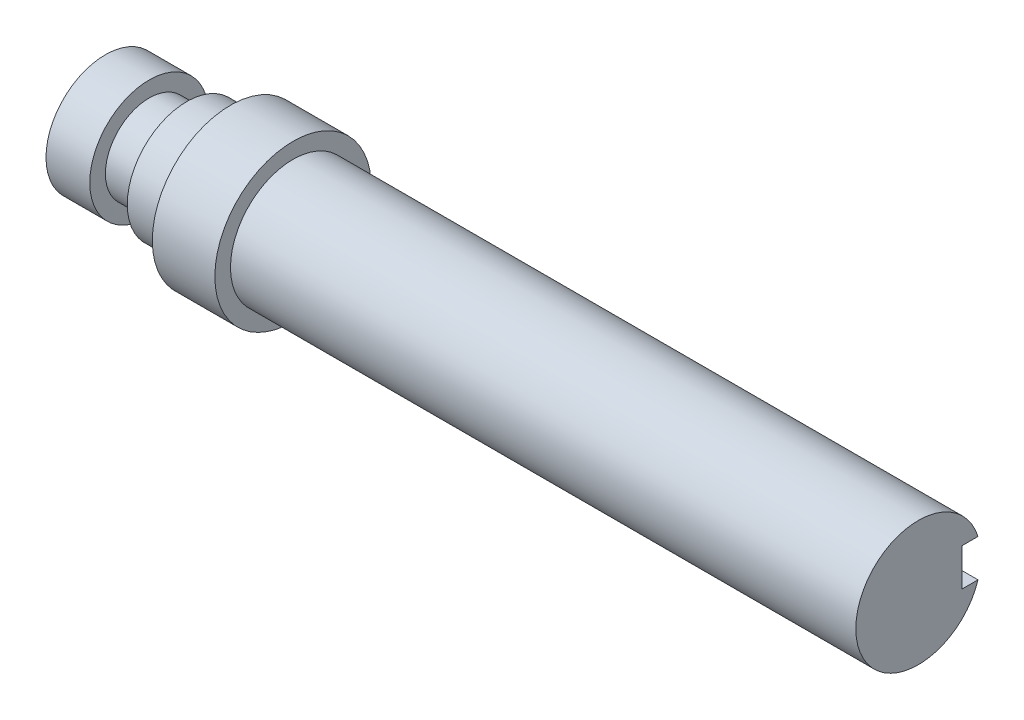
ISO-10303-21;
HEADER;
FILE_DESCRIPTION(('STEP AP214'),'2;1');
FILE_NAME('part.step','',(''),(''),'','','');
FILE_SCHEMA(('AUTOMOTIVE_DESIGN { 1 0 10303 214 1 1 1 1 }'));
ENDSEC;
DATA;
#1=APPLICATION_CONTEXT('core data for automotive mechanical design processes');
#2=APPLICATION_PROTOCOL_DEFINITION('international standard','automotive_design',2000,#1);
#3=PRODUCT_CONTEXT('',#1,'mechanical');
#4=PRODUCT('Part','Part','',(#3));
#5=PRODUCT_RELATED_PRODUCT_CATEGORY('part','',(#4));
#6=PRODUCT_DEFINITION_FORMATION('','',#4);
#7=PRODUCT_DEFINITION_CONTEXT('part definition',#1,'design');
#8=PRODUCT_DEFINITION('design','',#6,#7);
#9=PRODUCT_DEFINITION_SHAPE('','',#8);
#10=(LENGTH_UNIT() NAMED_UNIT(*) SI_UNIT(.MILLI.,.METRE.));
#11=(NAMED_UNIT(*) PLANE_ANGLE_UNIT() SI_UNIT($,.RADIAN.));
#12=(NAMED_UNIT(*) SI_UNIT($,.STERADIAN.) SOLID_ANGLE_UNIT());
#13=UNCERTAINTY_MEASURE_WITH_UNIT(LENGTH_MEASURE(1.E-05),#10,'distance_accuracy_value','');
#14=(GEOMETRIC_REPRESENTATION_CONTEXT(3) GLOBAL_UNCERTAINTY_ASSIGNED_CONTEXT((#13)) GLOBAL_UNIT_ASSIGNED_CONTEXT((#10,
#11,#12)) REPRESENTATION_CONTEXT('',''));
#15=CARTESIAN_POINT('',(0.,0.,0.));
#16=DIRECTION('',(0.,0.,1.));
#17=DIRECTION('',(1.,0.,0.));
#18=AXIS2_PLACEMENT_3D('',#15,#16,#17);
#19=CARTESIAN_POINT('',(0.,0.,0.));
#20=DIRECTION('',(-1.,0.,0.));
#21=DIRECTION('',(0.,0.,1.));
#22=AXIS2_PLACEMENT_3D('',#19,#20,#21);
#23=CYLINDRICAL_SURFACE('',#22,9.99999999999999);
#24=CARTESIAN_POINT('',(30.,0.,0.));
#25=DIRECTION('',(-1.,0.,0.));
#26=DIRECTION('',(0.,0.,1.));
#27=AXIS2_PLACEMENT_3D('',#24,#25,#26);
#28=CIRCLE('',#27,9.99999999999999);
#29=CARTESIAN_POINT('',(30.,0.,9.99999999999999));
#30=VERTEX_POINT('',#29);
#31=EDGE_CURVE('E134',#30,#30,#28,.T.);
#32=ORIENTED_EDGE('',*,*,#31,.F.);
#33=EDGE_LOOP('',(#32));
#34=FACE_BOUND('',#33,.T.);
#35=CARTESIAN_POINT('',(110.,0.,0.));
#36=DIRECTION('',(-1.,0.,0.));
#37=DIRECTION('',(0.,0.,1.));
#38=AXIS2_PLACEMENT_3D('',#35,#36,#37);
#39=CIRCLE('',#38,9.99999999999999);
#40=CARTESIAN_POINT('',(110.,3.,-9.53939201416945));
#41=VERTEX_POINT('',#40);
#42=CARTESIAN_POINT('',(110.,-3.,-9.53939201416945));
#43=VERTEX_POINT('',#42);
#44=EDGE_CURVE('E47',#41,#43,#39,.T.);
#45=ORIENTED_EDGE('',*,*,#44,.T.);
#46=DIRECTION('',(-1.,0.,0.));
#47=VECTOR('',#46,1.);
#48=CARTESIAN_POINT('',(0.,-3.,-9.53939201416945));
#49=LINE('',#48,#47);
#50=CARTESIAN_POINT('',(130.,-3.,-9.53939201416945));
#51=VERTEX_POINT('',#50);
#52=EDGE_CURVE('E11',#43,#51,#49,.F.);
#53=ORIENTED_EDGE('',*,*,#52,.T.);
#54=CARTESIAN_POINT('',(130.,0.,0.));
#55=DIRECTION('',(-1.,0.,0.));
#56=DIRECTION('',(0.,0.,1.));
#57=AXIS2_PLACEMENT_3D('',#54,#55,#56);
#58=CIRCLE('',#57,10.);
#59=CARTESIAN_POINT('',(130.,3.,-9.53939201416945));
#60=VERTEX_POINT('',#59);
#61=EDGE_CURVE('E102',#51,#60,#58,.T.);
#62=ORIENTED_EDGE('',*,*,#61,.T.);
#63=DIRECTION('',(-1.,0.,0.));
#64=VECTOR('',#63,1.);
#65=CARTESIAN_POINT('',(0.,3.,-9.53939201416945));
#66=LINE('',#65,#64);
#67=EDGE_CURVE('E138',#41,#60,#66,.F.);
#68=ORIENTED_EDGE('',*,*,#67,.F.);
#69=EDGE_LOOP('',(#45,#53,#62,#68));
#70=FACE_BOUND('',#69,.T.);
#71=ADVANCED_FACE('F39',(#34,#70),#23,.T.);
#72=CARTESIAN_POINT('',(0.,0.,-9.5));
#73=DIRECTION('',(1.,0.,0.));
#74=DIRECTION('',(0.,0.,-1.));
#75=AXIS2_PLACEMENT_3D('',#72,#73,#74);
#76=PLANE('',#75);
#77=CARTESIAN_POINT('',(0.,0.,0.));
#78=DIRECTION('',(-1.,0.,0.));
#79=DIRECTION('',(0.,0.,1.));
#80=AXIS2_PLACEMENT_3D('',#77,#78,#79);
#81=CIRCLE('',#80,9.5);
#82=CARTESIAN_POINT('',(0.,0.,9.5));
#83=VERTEX_POINT('',#82);
#84=EDGE_CURVE('E96',#83,#83,#81,.T.);
#85=ORIENTED_EDGE('',*,*,#84,.T.);
#86=EDGE_LOOP('',(#85));
#87=FACE_BOUND('',#86,.T.);
#88=ADVANCED_FACE('F41',(#87),#76,.F.);
#89=CARTESIAN_POINT('',(130.,0.,0.));
#90=DIRECTION('',(-1.,0.,0.));
#91=DIRECTION('',(0.,0.,1.));
#92=AXIS2_PLACEMENT_3D('',#89,#90,#91);
#93=PLANE('',#92);
#94=ORIENTED_EDGE('',*,*,#61,.F.);
#95=DIRECTION('',(0.,0.,1.));
#96=VECTOR('',#95,1.);
#97=CARTESIAN_POINT('',(130.,-3.,-9.99999999999999));
#98=LINE('',#97,#96);
#99=CARTESIAN_POINT('',(130.,-3.,-6.99999999999999));
#100=VERTEX_POINT('',#99);
#101=EDGE_CURVE('E82',#51,#100,#98,.T.);
#102=ORIENTED_EDGE('',*,*,#101,.T.);
#103=DIRECTION('',(0.,1.,0.));
#104=VECTOR('',#103,1.);
#105=CARTESIAN_POINT('',(130.,-3.,-6.99999999999999));
#106=LINE('',#105,#104);
#107=CARTESIAN_POINT('',(130.,3.,-6.99999999999999));
#108=VERTEX_POINT('',#107);
#109=EDGE_CURVE('E91',#100,#108,#106,.T.);
#110=ORIENTED_EDGE('',*,*,#109,.T.);
#111=DIRECTION('',(0.,0.,1.));
#112=VECTOR('',#111,1.);
#113=CARTESIAN_POINT('',(130.,3.,-9.99999999999999));
#114=LINE('',#113,#112);
#115=EDGE_CURVE('E107',#60,#108,#114,.T.);
#116=ORIENTED_EDGE('',*,*,#115,.F.);
#117=EDGE_LOOP('',(#94,#102,#110,#116));
#118=FACE_BOUND('',#117,.T.);
#119=ADVANCED_FACE('F100',(#118),#93,.F.);
#120=CARTESIAN_POINT('',(30.,0.,-9.99999999999999));
#121=DIRECTION('',(-1.,0.,0.));
#122=DIRECTION('',(0.,0.,1.));
#123=AXIS2_PLACEMENT_3D('',#120,#121,#122);
#124=PLANE('',#123);
#125=CARTESIAN_POINT('',(30.,0.,0.));
#126=DIRECTION('',(-1.,0.,0.));
#127=DIRECTION('',(0.,0.,1.));
#128=AXIS2_PLACEMENT_3D('',#125,#126,#127);
#129=CIRCLE('',#128,12.5);
#130=CARTESIAN_POINT('',(30.,0.,12.5));
#131=VERTEX_POINT('',#130);
#132=EDGE_CURVE('E131',#131,#131,#129,.T.);
#133=ORIENTED_EDGE('',*,*,#132,.F.);
#134=EDGE_LOOP('',(#133));
#135=FACE_BOUND('',#134,.T.);
#136=ORIENTED_EDGE('',*,*,#31,.T.);
#137=EDGE_LOOP('',(#136));
#138=FACE_BOUND('',#137,.T.);
#139=ADVANCED_FACE('F165',(#135,#138),#124,.F.);
#140=CARTESIAN_POINT('',(0.,0.,0.));
#141=DIRECTION('',(-1.,0.,0.));
#142=DIRECTION('',(0.,0.,1.));
#143=AXIS2_PLACEMENT_3D('',#140,#141,#142);
#144=CYLINDRICAL_SURFACE('',#143,12.5);
#145=CARTESIAN_POINT('',(20.,0.,0.));
#146=DIRECTION('',(-1.,0.,0.));
#147=DIRECTION('',(0.,0.,1.));
#148=AXIS2_PLACEMENT_3D('',#145,#146,#147);
#149=CIRCLE('',#148,12.5);
#150=CARTESIAN_POINT('',(20.,0.,12.5));
#151=VERTEX_POINT('',#150);
#152=EDGE_CURVE('E128',#151,#151,#149,.T.);
#153=ORIENTED_EDGE('',*,*,#152,.F.);
#154=EDGE_LOOP('',(#153));
#155=FACE_BOUND('',#154,.T.);
#156=ORIENTED_EDGE('',*,*,#132,.T.);
#157=EDGE_LOOP('',(#156));
#158=FACE_BOUND('',#157,.T.);
#159=ADVANCED_FACE('F170',(#155,#158),#144,.T.);
#160=CARTESIAN_POINT('',(20.,0.,-12.5));
#161=DIRECTION('',(1.,0.,0.));
#162=DIRECTION('',(0.,0.,-1.));
#163=AXIS2_PLACEMENT_3D('',#160,#161,#162);
#164=PLANE('',#163);
#165=CARTESIAN_POINT('',(20.,0.,0.));
#166=DIRECTION('',(-1.,0.,0.));
#167=DIRECTION('',(0.,0.,1.));
#168=AXIS2_PLACEMENT_3D('',#165,#166,#167);
#169=CIRCLE('',#168,9.5);
#170=CARTESIAN_POINT('',(20.,0.,9.5));
#171=VERTEX_POINT('',#170);
#172=EDGE_CURVE('E125',#171,#171,#169,.T.);
#173=ORIENTED_EDGE('',*,*,#172,.F.);
#174=EDGE_LOOP('',(#173));
#175=FACE_BOUND('',#174,.T.);
#176=ORIENTED_EDGE('',*,*,#152,.T.);
#177=EDGE_LOOP('',(#176));
#178=FACE_BOUND('',#177,.T.);
#179=ADVANCED_FACE('F175',(#175,#178),#164,.F.);
#180=CARTESIAN_POINT('',(0.,0.,0.));
#181=DIRECTION('',(-1.,0.,0.));
#182=DIRECTION('',(0.,0.,1.));
#183=AXIS2_PLACEMENT_3D('',#180,#181,#182);
#184=CYLINDRICAL_SURFACE('',#183,9.5);
#185=CARTESIAN_POINT('',(13.,0.,0.));
#186=DIRECTION('',(-1.,0.,0.));
#187=DIRECTION('',(0.,0.,1.));
#188=AXIS2_PLACEMENT_3D('',#185,#186,#187);
#189=CIRCLE('',#188,9.5);
#190=CARTESIAN_POINT('',(13.,0.,9.5));
#191=VERTEX_POINT('',#190);
#192=EDGE_CURVE('E122',#191,#191,#189,.T.);
#193=ORIENTED_EDGE('',*,*,#192,.F.);
#194=EDGE_LOOP('',(#193));
#195=FACE_BOUND('',#194,.T.);
#196=ORIENTED_EDGE('',*,*,#172,.T.);
#197=EDGE_LOOP('',(#196));
#198=FACE_BOUND('',#197,.T.);
#199=ADVANCED_FACE('F183',(#195,#198),#184,.T.);
#200=CARTESIAN_POINT('',(13.,0.,-9.5));
#201=DIRECTION('',(1.,0.,0.));
#202=DIRECTION('',(0.,0.,-1.));
#203=AXIS2_PLACEMENT_3D('',#200,#201,#202);
#204=PLANE('',#203);
#205=CARTESIAN_POINT('',(13.,0.,0.));
#206=DIRECTION('',(-1.,0.,0.));
#207=DIRECTION('',(0.,0.,1.));
#208=AXIS2_PLACEMENT_3D('',#205,#206,#207);
#209=CIRCLE('',#208,7.);
#210=CARTESIAN_POINT('',(13.,0.,7.));
#211=VERTEX_POINT('',#210);
#212=EDGE_CURVE('E119',#211,#211,#209,.T.);
#213=ORIENTED_EDGE('',*,*,#212,.F.);
#214=EDGE_LOOP('',(#213));
#215=FACE_BOUND('',#214,.T.);
#216=ORIENTED_EDGE('',*,*,#192,.T.);
#217=EDGE_LOOP('',(#216));
#218=FACE_BOUND('',#217,.T.);
#219=ADVANCED_FACE('F190',(#215,#218),#204,.F.);
#220=CARTESIAN_POINT('',(0.,0.,0.));
#221=DIRECTION('',(-1.,0.,0.));
#222=DIRECTION('',(0.,0.,1.));
#223=AXIS2_PLACEMENT_3D('',#220,#221,#222);
#224=CYLINDRICAL_SURFACE('',#223,7.);
#225=CARTESIAN_POINT('',(7.,0.,0.));
#226=DIRECTION('',(-1.,0.,0.));
#227=DIRECTION('',(0.,0.,1.));
#228=AXIS2_PLACEMENT_3D('',#225,#226,#227);
#229=CIRCLE('',#228,7.);
#230=CARTESIAN_POINT('',(7.,0.,7.));
#231=VERTEX_POINT('',#230);
#232=EDGE_CURVE('E116',#231,#231,#229,.T.);
#233=ORIENTED_EDGE('',*,*,#232,.F.);
#234=EDGE_LOOP('',(#233));
#235=FACE_BOUND('',#234,.T.);
#236=ORIENTED_EDGE('',*,*,#212,.T.);
#237=EDGE_LOOP('',(#236));
#238=FACE_BOUND('',#237,.T.);
#239=ADVANCED_FACE('F194',(#235,#238),#224,.T.);
#240=CARTESIAN_POINT('',(7.,0.,-9.5));
#241=DIRECTION('',(-1.,0.,0.));
#242=DIRECTION('',(0.,0.,1.));
#243=AXIS2_PLACEMENT_3D('',#240,#241,#242);
#244=PLANE('',#243);
#245=CARTESIAN_POINT('',(7.,0.,0.));
#246=DIRECTION('',(-1.,0.,0.));
#247=DIRECTION('',(0.,0.,1.));
#248=AXIS2_PLACEMENT_3D('',#245,#246,#247);
#249=CIRCLE('',#248,9.5);
#250=CARTESIAN_POINT('',(7.,0.,9.5));
#251=VERTEX_POINT('',#250);
#252=EDGE_CURVE('E113',#251,#251,#249,.T.);
#253=ORIENTED_EDGE('',*,*,#252,.F.);
#254=EDGE_LOOP('',(#253));
#255=FACE_BOUND('',#254,.T.);
#256=ORIENTED_EDGE('',*,*,#232,.T.);
#257=EDGE_LOOP('',(#256));
#258=FACE_BOUND('',#257,.T.);
#259=ADVANCED_FACE('F151',(#255,#258),#244,.F.);
#260=CARTESIAN_POINT('',(0.,0.,0.));
#261=DIRECTION('',(-1.,0.,0.));
#262=DIRECTION('',(0.,0.,1.));
#263=AXIS2_PLACEMENT_3D('',#260,#261,#262);
#264=CYLINDRICAL_SURFACE('',#263,9.5);
#265=ORIENTED_EDGE('',*,*,#84,.F.);
#266=EDGE_LOOP('',(#265));
#267=FACE_BOUND('',#266,.T.);
#268=ORIENTED_EDGE('',*,*,#252,.T.);
#269=EDGE_LOOP('',(#268));
#270=FACE_BOUND('',#269,.T.);
#271=ADVANCED_FACE('F143',(#267,#270),#264,.T.);
#272=CARTESIAN_POINT('',(110.,-3.,-10.));
#273=DIRECTION('',(-1.,0.,0.));
#274=DIRECTION('',(0.,0.,1.));
#275=AXIS2_PLACEMENT_3D('',#272,#273,#274);
#276=PLANE('',#275);
#277=DIRECTION('',(0.,0.,1.));
#278=VECTOR('',#277,1.);
#279=CARTESIAN_POINT('',(110.,3.,-10.));
#280=LINE('',#279,#278);
#281=CARTESIAN_POINT('',(110.,3.,-6.99999999999999));
#282=VERTEX_POINT('',#281);
#283=EDGE_CURVE('E54',#41,#282,#280,.T.);
#284=ORIENTED_EDGE('',*,*,#283,.T.);
#285=DIRECTION('',(0.,1.,0.));
#286=VECTOR('',#285,1.);
#287=CARTESIAN_POINT('',(110.,-3.,-6.99999999999999));
#288=LINE('',#287,#286);
#289=CARTESIAN_POINT('',(110.,-3.,-6.99999999999999));
#290=VERTEX_POINT('',#289);
#291=EDGE_CURVE('E97',#290,#282,#288,.T.);
#292=ORIENTED_EDGE('',*,*,#291,.F.);
#293=DIRECTION('',(0.,0.,1.));
#294=VECTOR('',#293,1.);
#295=CARTESIAN_POINT('',(110.,-3.,-10.));
#296=LINE('',#295,#294);
#297=EDGE_CURVE('E84',#43,#290,#296,.T.);
#298=ORIENTED_EDGE('',*,*,#297,.F.);
#299=ORIENTED_EDGE('',*,*,#44,.F.);
#300=EDGE_LOOP('',(#284,#292,#298,#299));
#301=FACE_BOUND('',#300,.T.);
#302=ADVANCED_FACE('F141',(#301),#276,.F.);
#303=CARTESIAN_POINT('',(0.,-3.,0.));
#304=DIRECTION('',(0.,-1.,0.));
#305=DIRECTION('',(0.,0.,-1.));
#306=AXIS2_PLACEMENT_3D('',#303,#304,#305);
#307=PLANE('',#306);
#308=ORIENTED_EDGE('',*,*,#297,.T.);
#309=DIRECTION('',(-1.,0.,0.));
#310=VECTOR('',#309,1.);
#311=CARTESIAN_POINT('',(130.,-3.,-6.99999999999999));
#312=LINE('',#311,#310);
#313=EDGE_CURVE('E78',#100,#290,#312,.T.);
#314=ORIENTED_EDGE('',*,*,#313,.F.);
#315=ORIENTED_EDGE('',*,*,#101,.F.);
#316=ORIENTED_EDGE('',*,*,#52,.F.);
#317=EDGE_LOOP('',(#308,#314,#315,#316));
#318=FACE_BOUND('',#317,.T.);
#319=ADVANCED_FACE('F80',(#318),#307,.F.);
#320=CARTESIAN_POINT('',(0.,3.,0.));
#321=DIRECTION('',(0.,-1.,0.));
#322=DIRECTION('',(0.,0.,-1.));
#323=AXIS2_PLACEMENT_3D('',#320,#321,#322);
#324=PLANE('',#323);
#325=ORIENTED_EDGE('',*,*,#67,.T.);
#326=ORIENTED_EDGE('',*,*,#115,.T.);
#327=DIRECTION('',(-1.,0.,0.));
#328=VECTOR('',#327,1.);
#329=CARTESIAN_POINT('',(130.,3.,-6.99999999999999));
#330=LINE('',#329,#328);
#331=EDGE_CURVE('E93',#108,#282,#330,.T.);
#332=ORIENTED_EDGE('',*,*,#331,.T.);
#333=ORIENTED_EDGE('',*,*,#283,.F.);
#334=EDGE_LOOP('',(#325,#326,#332,#333));
#335=FACE_BOUND('',#334,.T.);
#336=ADVANCED_FACE('F139',(#335),#324,.T.);
#337=CARTESIAN_POINT('',(130.,-3.,-6.99999999999999));
#338=DIRECTION('',(0.,0.,-1.));
#339=DIRECTION('',(-1.,0.,0.));
#340=AXIS2_PLACEMENT_3D('',#337,#338,#339);
#341=PLANE('',#340);
#342=ORIENTED_EDGE('',*,*,#331,.F.);
#343=ORIENTED_EDGE('',*,*,#109,.F.);
#344=ORIENTED_EDGE('',*,*,#313,.T.);
#345=ORIENTED_EDGE('',*,*,#291,.T.);
#346=EDGE_LOOP('',(#342,#343,#344,#345));
#347=FACE_BOUND('',#346,.T.);
#348=ADVANCED_FACE('F92',(#347),#341,.T.);
#349=CLOSED_SHELL('',(#71,#88,#119,#139,#159,#179,#199,#219,#239,#259,#271,#302,#319,#336,#348));
#350=MANIFOLD_SOLID_BREP('B2',#349);
#351=ADVANCED_BREP_SHAPE_REPRESENTATION('',(#18,#350),#14);
#352=SHAPE_DEFINITION_REPRESENTATION(#9,#351);
ENDSEC;
END-ISO-10303-21;
